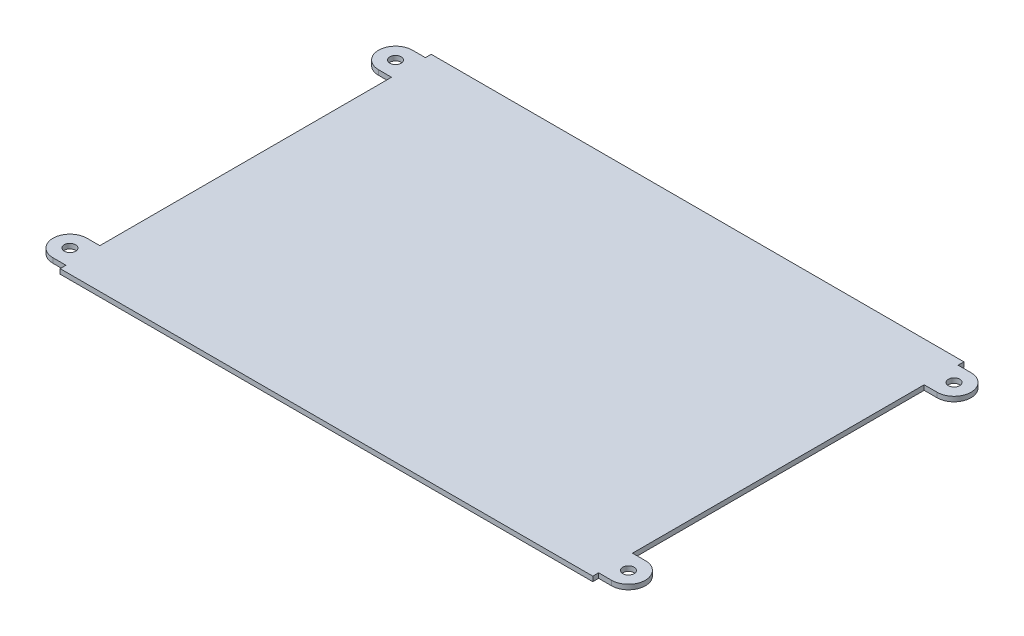
ISO-10303-21;
HEADER;
FILE_DESCRIPTION(('STEP AP214'),'2;1');
FILE_NAME('part.step','',(''),(''),'','','');
FILE_SCHEMA(('AUTOMOTIVE_DESIGN { 1 0 10303 214 1 1 1 1 }'));
ENDSEC;
DATA;
#1=APPLICATION_CONTEXT('core data for automotive mechanical design processes');
#2=APPLICATION_PROTOCOL_DEFINITION('international standard','automotive_design',2000,#1);
#3=PRODUCT_CONTEXT('',#1,'mechanical');
#4=PRODUCT('Part','Part','',(#3));
#5=PRODUCT_RELATED_PRODUCT_CATEGORY('part','',(#4));
#6=PRODUCT_DEFINITION_FORMATION('','',#4);
#7=PRODUCT_DEFINITION_CONTEXT('part definition',#1,'design');
#8=PRODUCT_DEFINITION('design','',#6,#7);
#9=PRODUCT_DEFINITION_SHAPE('','',#8);
#10=(LENGTH_UNIT() NAMED_UNIT(*) SI_UNIT(.MILLI.,.METRE.));
#11=(NAMED_UNIT(*) PLANE_ANGLE_UNIT() SI_UNIT($,.RADIAN.));
#12=(NAMED_UNIT(*) SI_UNIT($,.STERADIAN.) SOLID_ANGLE_UNIT());
#13=UNCERTAINTY_MEASURE_WITH_UNIT(LENGTH_MEASURE(1.E-05),#10,'distance_accuracy_value','');
#14=(GEOMETRIC_REPRESENTATION_CONTEXT(3) GLOBAL_UNCERTAINTY_ASSIGNED_CONTEXT((#13)) GLOBAL_UNIT_ASSIGNED_CONTEXT((#10,
#11,#12)) REPRESENTATION_CONTEXT('',''));
#15=CARTESIAN_POINT('',(0.,0.,0.));
#16=DIRECTION('',(0.,0.,1.));
#17=DIRECTION('',(1.,0.,0.));
#18=AXIS2_PLACEMENT_3D('',#15,#16,#17);
#19=CARTESIAN_POINT('',(82.45,1.5,57.45));
#20=DIRECTION('',(-1.,0.,0.));
#21=DIRECTION('',(0.,0.,1.));
#22=AXIS2_PLACEMENT_3D('',#19,#20,#21);
#23=PLANE('',#22);
#24=DIRECTION('',(0.,1.,0.));
#25=VECTOR('',#24,1.);
#26=CARTESIAN_POINT('',(82.45,-13.9933019691565,45.15));
#27=LINE('',#26,#25);
#28=CARTESIAN_POINT('',(82.45,0.,45.15));
#29=VERTEX_POINT('',#28);
#30=CARTESIAN_POINT('',(82.45,1.5,45.15));
#31=VERTEX_POINT('',#30);
#32=EDGE_CURVE('E184',#29,#31,#27,.T.);
#33=ORIENTED_EDGE('',*,*,#32,.F.);
#34=DIRECTION('',(0.,0.,-1.));
#35=VECTOR('',#34,1.);
#36=CARTESIAN_POINT('',(82.45,0.,57.45));
#37=LINE('',#36,#35);
#38=CARTESIAN_POINT('',(82.45,0.,-45.15));
#39=VERTEX_POINT('',#38);
#40=EDGE_CURVE('E201',#29,#39,#37,.T.);
#41=ORIENTED_EDGE('',*,*,#40,.T.);
#42=DIRECTION('',(0.,1.,0.));
#43=VECTOR('',#42,1.);
#44=CARTESIAN_POINT('',(82.45,-13.9933019691565,-45.15));
#45=LINE('',#44,#43);
#46=CARTESIAN_POINT('',(82.45,1.5,-45.15));
#47=VERTEX_POINT('',#46);
#48=EDGE_CURVE('E233',#39,#47,#45,.T.);
#49=ORIENTED_EDGE('',*,*,#48,.T.);
#50=DIRECTION('',(0.,0.,-1.));
#51=VECTOR('',#50,1.);
#52=CARTESIAN_POINT('',(82.45,1.5,57.45));
#53=LINE('',#52,#51);
#54=EDGE_CURVE('E37',#31,#47,#53,.T.);
#55=ORIENTED_EDGE('',*,*,#54,.F.);
#56=EDGE_LOOP('',(#33,#41,#49,#55));
#57=FACE_BOUND('',#56,.T.);
#58=ADVANCED_FACE('F33',(#57),#23,.F.);
#59=DIRECTION('',(0.,1.,0.));
#60=VECTOR('',#59,1.);
#61=CARTESIAN_POINT('',(82.45,-13.9933019691565,55.65));
#62=LINE('',#61,#60);
#63=CARTESIAN_POINT('',(82.45,0.,55.65));
#64=VERTEX_POINT('',#63);
#65=CARTESIAN_POINT('',(82.45,1.5,55.65));
#66=VERTEX_POINT('',#65);
#67=EDGE_CURVE('E58',#64,#66,#62,.T.);
#68=ORIENTED_EDGE('',*,*,#67,.T.);
#69=CARTESIAN_POINT('',(82.45,1.5,57.45));
#70=VERTEX_POINT('',#69);
#71=EDGE_CURVE('E298',#70,#66,#53,.T.);
#72=ORIENTED_EDGE('',*,*,#71,.F.);
#73=DIRECTION('',(0.,-1.,0.));
#74=VECTOR('',#73,1.);
#75=CARTESIAN_POINT('',(82.45,1.5,57.45));
#76=LINE('',#75,#74);
#77=CARTESIAN_POINT('',(82.45,0.,57.45));
#78=VERTEX_POINT('',#77);
#79=EDGE_CURVE('E43',#70,#78,#76,.T.);
#80=ORIENTED_EDGE('',*,*,#79,.T.);
#81=EDGE_CURVE('E254',#78,#64,#37,.T.);
#82=ORIENTED_EDGE('',*,*,#81,.T.);
#83=EDGE_LOOP('',(#68,#72,#80,#82));
#84=FACE_BOUND('',#83,.T.);
#85=ADVANCED_FACE('F323',(#84),#23,.F.);
#86=DIRECTION('',(0.,1.,0.));
#87=VECTOR('',#86,1.);
#88=CARTESIAN_POINT('',(82.45,-13.9933019691565,-55.65));
#89=LINE('',#88,#87);
#90=CARTESIAN_POINT('',(82.45,0.,-55.65));
#91=VERTEX_POINT('',#90);
#92=CARTESIAN_POINT('',(82.45,1.5,-55.65));
#93=VERTEX_POINT('',#92);
#94=EDGE_CURVE('E241',#91,#93,#89,.T.);
#95=ORIENTED_EDGE('',*,*,#94,.F.);
#96=CARTESIAN_POINT('',(82.45,0.,-57.45));
#97=VERTEX_POINT('',#96);
#98=EDGE_CURVE('E255',#91,#97,#37,.T.);
#99=ORIENTED_EDGE('',*,*,#98,.T.);
#100=DIRECTION('',(0.,-1.,0.));
#101=VECTOR('',#100,1.);
#102=CARTESIAN_POINT('',(82.45,1.5,-57.45));
#103=LINE('',#102,#101);
#104=CARTESIAN_POINT('',(82.45,1.5,-57.45));
#105=VERTEX_POINT('',#104);
#106=EDGE_CURVE('E321',#105,#97,#103,.T.);
#107=ORIENTED_EDGE('',*,*,#106,.F.);
#108=EDGE_CURVE('E303',#93,#105,#53,.T.);
#109=ORIENTED_EDGE('',*,*,#108,.F.);
#110=EDGE_LOOP('',(#95,#99,#107,#109));
#111=FACE_BOUND('',#110,.T.);
#112=ADVANCED_FACE('F325',(#111),#23,.F.);
#113=CARTESIAN_POINT('',(-82.45,1.5,57.45));
#114=DIRECTION('',(1.,0.,0.));
#115=DIRECTION('',(0.,0.,-1.));
#116=AXIS2_PLACEMENT_3D('',#113,#114,#115);
#117=PLANE('',#116);
#118=DIRECTION('',(0.,0.,1.));
#119=VECTOR('',#118,1.);
#120=CARTESIAN_POINT('',(-82.45,0.,57.45));
#121=LINE('',#120,#119);
#122=CARTESIAN_POINT('',(-82.45,0.,-45.15));
#123=VERTEX_POINT('',#122);
#124=CARTESIAN_POINT('',(-82.45,0.,45.15));
#125=VERTEX_POINT('',#124);
#126=EDGE_CURVE('E289',#123,#125,#121,.T.);
#127=ORIENTED_EDGE('',*,*,#126,.T.);
#128=DIRECTION('',(0.,1.,0.));
#129=VECTOR('',#128,1.);
#130=CARTESIAN_POINT('',(-82.45,-13.9933019691565,45.15));
#131=LINE('',#130,#129);
#132=CARTESIAN_POINT('',(-82.45,1.5,45.15));
#133=VERTEX_POINT('',#132);
#134=EDGE_CURVE('E358',#125,#133,#131,.T.);
#135=ORIENTED_EDGE('',*,*,#134,.T.);
#136=DIRECTION('',(0.,0.,1.));
#137=VECTOR('',#136,1.);
#138=CARTESIAN_POINT('',(-82.45,1.5,57.45));
#139=LINE('',#138,#137);
#140=CARTESIAN_POINT('',(-82.45,1.5,-45.15));
#141=VERTEX_POINT('',#140);
#142=EDGE_CURVE('E272',#141,#133,#139,.T.);
#143=ORIENTED_EDGE('',*,*,#142,.F.);
#144=DIRECTION('',(0.,1.,0.));
#145=VECTOR('',#144,1.);
#146=CARTESIAN_POINT('',(-82.45,-13.9933019691565,-45.15));
#147=LINE('',#146,#145);
#148=EDGE_CURVE('E360',#123,#141,#147,.T.);
#149=ORIENTED_EDGE('',*,*,#148,.F.);
#150=EDGE_LOOP('',(#127,#135,#143,#149));
#151=FACE_BOUND('',#150,.T.);
#152=ADVANCED_FACE('F331',(#151),#117,.F.);
#153=CARTESIAN_POINT('',(-82.45,1.5,55.65));
#154=VERTEX_POINT('',#153);
#155=CARTESIAN_POINT('',(-82.45,1.5,57.45));
#156=VERTEX_POINT('',#155);
#157=EDGE_CURVE('E269',#154,#156,#139,.T.);
#158=ORIENTED_EDGE('',*,*,#157,.F.);
#159=DIRECTION('',(0.,1.,0.));
#160=VECTOR('',#159,1.);
#161=CARTESIAN_POINT('',(-82.45,-13.9933019691565,55.65));
#162=LINE('',#161,#160);
#163=CARTESIAN_POINT('',(-82.45,0.,55.65));
#164=VERTEX_POINT('',#163);
#165=EDGE_CURVE('E376',#164,#154,#162,.T.);
#166=ORIENTED_EDGE('',*,*,#165,.F.);
#167=CARTESIAN_POINT('',(-82.45,0.,57.45));
#168=VERTEX_POINT('',#167);
#169=EDGE_CURVE('E273',#164,#168,#121,.T.);
#170=ORIENTED_EDGE('',*,*,#169,.T.);
#171=DIRECTION('',(0.,-1.,0.));
#172=VECTOR('',#171,1.);
#173=CARTESIAN_POINT('',(-82.45,1.5,57.45));
#174=LINE('',#173,#172);
#175=EDGE_CURVE('E11',#156,#168,#174,.T.);
#176=ORIENTED_EDGE('',*,*,#175,.F.);
#177=EDGE_LOOP('',(#158,#166,#170,#176));
#178=FACE_BOUND('',#177,.T.);
#179=ADVANCED_FACE('F342',(#178),#117,.F.);
#180=CARTESIAN_POINT('',(-82.45,0.,-57.45));
#181=VERTEX_POINT('',#180);
#182=CARTESIAN_POINT('',(-82.45,0.,-55.65));
#183=VERTEX_POINT('',#182);
#184=EDGE_CURVE('E291',#181,#183,#121,.T.);
#185=ORIENTED_EDGE('',*,*,#184,.T.);
#186=DIRECTION('',(0.,1.,0.));
#187=VECTOR('',#186,1.);
#188=CARTESIAN_POINT('',(-82.45,-13.9933019691565,-55.65));
#189=LINE('',#188,#187);
#190=CARTESIAN_POINT('',(-82.45,1.5,-55.6499999999999));
#191=VERTEX_POINT('',#190);
#192=EDGE_CURVE('E401',#183,#191,#189,.T.);
#193=ORIENTED_EDGE('',*,*,#192,.T.);
#194=CARTESIAN_POINT('',(-82.45,1.5,-57.45));
#195=VERTEX_POINT('',#194);
#196=EDGE_CURVE('E286',#195,#191,#139,.T.);
#197=ORIENTED_EDGE('',*,*,#196,.F.);
#198=DIRECTION('',(0.,-1.,0.));
#199=VECTOR('',#198,1.);
#200=CARTESIAN_POINT('',(-82.45,1.5,-57.45));
#201=LINE('',#200,#199);
#202=EDGE_CURVE('E297',#195,#181,#201,.T.);
#203=ORIENTED_EDGE('',*,*,#202,.T.);
#204=EDGE_LOOP('',(#185,#193,#197,#203));
#205=FACE_BOUND('',#204,.T.);
#206=ADVANCED_FACE('F35',(#205),#117,.F.);
#207=CARTESIAN_POINT('',(-82.45,1.5,57.45));
#208=DIRECTION('',(0.,0.,-1.));
#209=DIRECTION('',(-1.,0.,0.));
#210=AXIS2_PLACEMENT_3D('',#207,#208,#209);
#211=PLANE('',#210);
#212=DIRECTION('',(1.,0.,0.));
#213=VECTOR('',#212,1.);
#214=CARTESIAN_POINT('',(-82.45,0.,57.45));
#215=LINE('',#214,#213);
#216=EDGE_CURVE('E259',#168,#78,#215,.T.);
#217=ORIENTED_EDGE('',*,*,#216,.T.);
#218=ORIENTED_EDGE('',*,*,#79,.F.);
#219=DIRECTION('',(1.,0.,0.));
#220=VECTOR('',#219,1.);
#221=CARTESIAN_POINT('',(-82.45,1.5,57.45));
#222=LINE('',#221,#220);
#223=EDGE_CURVE('E280',#156,#70,#222,.T.);
#224=ORIENTED_EDGE('',*,*,#223,.F.);
#225=ORIENTED_EDGE('',*,*,#175,.T.);
#226=EDGE_LOOP('',(#217,#218,#224,#225));
#227=FACE_BOUND('',#226,.T.);
#228=ADVANCED_FACE('F318',(#227),#211,.F.);
#229=CARTESIAN_POINT('',(-82.45,1.5,-57.45));
#230=DIRECTION('',(0.,0.,1.));
#231=DIRECTION('',(1.,0.,0.));
#232=AXIS2_PLACEMENT_3D('',#229,#230,#231);
#233=PLANE('',#232);
#234=DIRECTION('',(-1.,0.,0.));
#235=VECTOR('',#234,1.);
#236=CARTESIAN_POINT('',(-82.45,0.,-57.45));
#237=LINE('',#236,#235);
#238=EDGE_CURVE('E261',#97,#181,#237,.T.);
#239=ORIENTED_EDGE('',*,*,#238,.T.);
#240=ORIENTED_EDGE('',*,*,#202,.F.);
#241=DIRECTION('',(-1.,0.,0.));
#242=VECTOR('',#241,1.);
#243=CARTESIAN_POINT('',(-82.45,1.5,-57.45));
#244=LINE('',#243,#242);
#245=EDGE_CURVE('E294',#105,#195,#244,.T.);
#246=ORIENTED_EDGE('',*,*,#245,.F.);
#247=ORIENTED_EDGE('',*,*,#106,.T.);
#248=EDGE_LOOP('',(#239,#240,#246,#247));
#249=FACE_BOUND('',#248,.T.);
#250=ADVANCED_FACE('F334',(#249),#233,.F.);
#251=CARTESIAN_POINT('',(0.,1.5,0.));
#252=DIRECTION('',(0.,-1.,0.));
#253=DIRECTION('',(0.,0.,-1.));
#254=AXIS2_PLACEMENT_3D('',#251,#252,#253);
#255=PLANE('',#254);
#256=ORIENTED_EDGE('',*,*,#196,.T.);
#257=DIRECTION('',(-1.,0.,0.));
#258=VECTOR('',#257,1.);
#259=CARTESIAN_POINT('',(-86.45,1.5,-55.65));
#260=LINE('',#259,#258);
#261=CARTESIAN_POINT('',(-86.45,1.5,-55.65));
#262=VERTEX_POINT('',#261);
#263=EDGE_CURVE('E394',#191,#262,#260,.T.);
#264=ORIENTED_EDGE('',*,*,#263,.T.);
#265=CARTESIAN_POINT('',(-86.45,1.5,-50.4));
#266=DIRECTION('',(0.,1.,0.));
#267=DIRECTION('',(0.,0.,1.));
#268=AXIS2_PLACEMENT_3D('',#265,#266,#267);
#269=CIRCLE('',#268,5.24999999999999);
#270=CARTESIAN_POINT('',(-86.45,1.5,-45.15));
#271=VERTEX_POINT('',#270);
#272=EDGE_CURVE('E384',#262,#271,#269,.T.);
#273=ORIENTED_EDGE('',*,*,#272,.T.);
#274=DIRECTION('',(1.,0.,0.));
#275=VECTOR('',#274,1.);
#276=CARTESIAN_POINT('',(-86.45,1.5,-45.15));
#277=LINE('',#276,#275);
#278=EDGE_CURVE('E387',#271,#141,#277,.T.);
#279=ORIENTED_EDGE('',*,*,#278,.T.);
#280=ORIENTED_EDGE('',*,*,#142,.T.);
#281=DIRECTION('',(-1.,0.,0.));
#282=VECTOR('',#281,1.);
#283=CARTESIAN_POINT('',(-86.45,1.5,45.15));
#284=LINE('',#283,#282);
#285=CARTESIAN_POINT('',(-86.45,1.5,45.15));
#286=VERTEX_POINT('',#285);
#287=EDGE_CURVE('E372',#133,#286,#284,.T.);
#288=ORIENTED_EDGE('',*,*,#287,.T.);
#289=CARTESIAN_POINT('',(-86.45,1.5,50.4));
#290=DIRECTION('',(0.,1.,0.));
#291=DIRECTION('',(0.,0.,1.));
#292=AXIS2_PLACEMENT_3D('',#289,#290,#291);
#293=CIRCLE('',#292,5.24999999999999);
#294=CARTESIAN_POINT('',(-86.45,1.5,55.65));
#295=VERTEX_POINT('',#294);
#296=EDGE_CURVE('E453',#286,#295,#293,.T.);
#297=ORIENTED_EDGE('',*,*,#296,.T.);
#298=DIRECTION('',(1.,0.,0.));
#299=VECTOR('',#298,1.);
#300=CARTESIAN_POINT('',(-86.45,1.5,55.65));
#301=LINE('',#300,#299);
#302=EDGE_CURVE('E451',#295,#154,#301,.T.);
#303=ORIENTED_EDGE('',*,*,#302,.T.);
#304=ORIENTED_EDGE('',*,*,#157,.T.);
#305=ORIENTED_EDGE('',*,*,#223,.T.);
#306=ORIENTED_EDGE('',*,*,#71,.T.);
#307=DIRECTION('',(-1.,0.,0.));
#308=VECTOR('',#307,1.);
#309=CARTESIAN_POINT('',(86.45,1.5,55.65));
#310=LINE('',#309,#308);
#311=CARTESIAN_POINT('',(86.45,1.5,55.65));
#312=VERTEX_POINT('',#311);
#313=EDGE_CURVE('E185',#312,#66,#310,.T.);
#314=ORIENTED_EDGE('',*,*,#313,.F.);
#315=CARTESIAN_POINT('',(86.45,1.5,50.4));
#316=DIRECTION('',(0.,-1.,0.));
#317=DIRECTION('',(0.,0.,1.));
#318=AXIS2_PLACEMENT_3D('',#315,#316,#317);
#319=CIRCLE('',#318,5.24999999999999);
#320=CARTESIAN_POINT('',(86.45,1.5,45.15));
#321=VERTEX_POINT('',#320);
#322=EDGE_CURVE('E210',#321,#312,#319,.T.);
#323=ORIENTED_EDGE('',*,*,#322,.F.);
#324=DIRECTION('',(1.,0.,0.));
#325=VECTOR('',#324,1.);
#326=CARTESIAN_POINT('',(86.45,1.5,45.15));
#327=LINE('',#326,#325);
#328=EDGE_CURVE('E180',#31,#321,#327,.T.);
#329=ORIENTED_EDGE('',*,*,#328,.F.);
#330=ORIENTED_EDGE('',*,*,#54,.T.);
#331=DIRECTION('',(-1.,0.,0.));
#332=VECTOR('',#331,1.);
#333=CARTESIAN_POINT('',(86.45,1.5,-45.15));
#334=LINE('',#333,#332);
#335=CARTESIAN_POINT('',(86.45,1.5,-45.15));
#336=VERTEX_POINT('',#335);
#337=EDGE_CURVE('E248',#336,#47,#334,.T.);
#338=ORIENTED_EDGE('',*,*,#337,.F.);
#339=CARTESIAN_POINT('',(86.45,1.5,-50.4));
#340=DIRECTION('',(0.,-1.,0.));
#341=DIRECTION('',(0.,0.,1.));
#342=AXIS2_PLACEMENT_3D('',#339,#340,#341);
#343=CIRCLE('',#342,5.24999999999999);
#344=CARTESIAN_POINT('',(86.45,1.5,-55.65));
#345=VERTEX_POINT('',#344);
#346=EDGE_CURVE('E226',#345,#336,#343,.T.);
#347=ORIENTED_EDGE('',*,*,#346,.F.);
#348=DIRECTION('',(1.,0.,0.));
#349=VECTOR('',#348,1.);
#350=CARTESIAN_POINT('',(86.45,1.5,-55.65));
#351=LINE('',#350,#349);
#352=EDGE_CURVE('E229',#93,#345,#351,.T.);
#353=ORIENTED_EDGE('',*,*,#352,.F.);
#354=ORIENTED_EDGE('',*,*,#108,.T.);
#355=ORIENTED_EDGE('',*,*,#245,.T.);
#356=EDGE_LOOP('',(#256,#264,#273,#279,#280,#288,#297,#303,#304,#305,#306,#314,#323,#329,#330,
#338,#347,#353,#354,#355));
#357=FACE_BOUND('',#356,.T.);
#358=CARTESIAN_POINT('',(-86.45,1.5,-50.4));
#359=DIRECTION('',(0.,1.,0.));
#360=DIRECTION('',(0.,0.,1.));
#361=AXIS2_PLACEMENT_3D('',#358,#359,#360);
#362=CIRCLE('',#361,1.75);
#363=CARTESIAN_POINT('',(-86.45,1.5,-48.65));
#364=VERTEX_POINT('',#363);
#365=EDGE_CURVE('E388',#364,#364,#362,.T.);
#366=ORIENTED_EDGE('',*,*,#365,.F.);
#367=EDGE_LOOP('',(#366));
#368=FACE_BOUND('',#367,.T.);
#369=CARTESIAN_POINT('',(-86.45,1.5,50.4));
#370=DIRECTION('',(0.,1.,0.));
#371=DIRECTION('',(0.,0.,1.));
#372=AXIS2_PLACEMENT_3D('',#369,#370,#371);
#373=CIRCLE('',#372,1.75);
#374=CARTESIAN_POINT('',(-86.45,1.5,52.15));
#375=VERTEX_POINT('',#374);
#376=EDGE_CURVE('E382',#375,#375,#373,.T.);
#377=ORIENTED_EDGE('',*,*,#376,.F.);
#378=EDGE_LOOP('',(#377));
#379=FACE_BOUND('',#378,.T.);
#380=CARTESIAN_POINT('',(86.45,1.5,-50.4));
#381=DIRECTION('',(0.,-1.,0.));
#382=DIRECTION('',(0.,0.,1.));
#383=AXIS2_PLACEMENT_3D('',#380,#381,#382);
#384=CIRCLE('',#383,1.75);
#385=CARTESIAN_POINT('',(86.45,1.5,-48.65));
#386=VERTEX_POINT('',#385);
#387=EDGE_CURVE('E222',#386,#386,#384,.T.);
#388=ORIENTED_EDGE('',*,*,#387,.T.);
#389=EDGE_LOOP('',(#388));
#390=FACE_BOUND('',#389,.T.);
#391=CARTESIAN_POINT('',(86.45,1.5,50.4));
#392=DIRECTION('',(0.,-1.,0.));
#393=DIRECTION('',(0.,0.,1.));
#394=AXIS2_PLACEMENT_3D('',#391,#392,#393);
#395=CIRCLE('',#394,1.75);
#396=CARTESIAN_POINT('',(86.45,1.5,52.15));
#397=VERTEX_POINT('',#396);
#398=EDGE_CURVE('E194',#397,#397,#395,.T.);
#399=ORIENTED_EDGE('',*,*,#398,.T.);
#400=EDGE_LOOP('',(#399));
#401=FACE_BOUND('',#400,.T.);
#402=ADVANCED_FACE('F312',(#357,#368,#379,#390,#401),#255,.F.);
#403=CARTESIAN_POINT('',(0.,0.,0.));
#404=DIRECTION('',(0.,-1.,0.));
#405=DIRECTION('',(0.,0.,-1.));
#406=AXIS2_PLACEMENT_3D('',#403,#404,#405);
#407=PLANE('',#406);
#408=ORIENTED_EDGE('',*,*,#184,.F.);
#409=ORIENTED_EDGE('',*,*,#238,.F.);
#410=ORIENTED_EDGE('',*,*,#98,.F.);
#411=DIRECTION('',(1.,0.,0.));
#412=VECTOR('',#411,1.);
#413=CARTESIAN_POINT('',(86.45,0.,-55.65));
#414=LINE('',#413,#412);
#415=CARTESIAN_POINT('',(86.45,0.,-55.65));
#416=VERTEX_POINT('',#415);
#417=EDGE_CURVE('E245',#91,#416,#414,.T.);
#418=ORIENTED_EDGE('',*,*,#417,.T.);
#419=CARTESIAN_POINT('',(86.45,0.,-50.4));
#420=DIRECTION('',(0.,-1.,0.));
#421=DIRECTION('',(0.,0.,-1.));
#422=AXIS2_PLACEMENT_3D('',#419,#420,#421);
#423=CIRCLE('',#422,5.24999999999999);
#424=CARTESIAN_POINT('',(86.45,0.,-45.15));
#425=VERTEX_POINT('',#424);
#426=EDGE_CURVE('E219',#416,#425,#423,.T.);
#427=ORIENTED_EDGE('',*,*,#426,.T.);
#428=DIRECTION('',(-1.,0.,0.));
#429=VECTOR('',#428,1.);
#430=CARTESIAN_POINT('',(86.45,0.,-45.15));
#431=LINE('',#430,#429);
#432=EDGE_CURVE('E223',#425,#39,#431,.T.);
#433=ORIENTED_EDGE('',*,*,#432,.T.);
#434=ORIENTED_EDGE('',*,*,#40,.F.);
#435=DIRECTION('',(1.,0.,0.));
#436=VECTOR('',#435,1.);
#437=CARTESIAN_POINT('',(86.45,0.,45.15));
#438=LINE('',#437,#436);
#439=CARTESIAN_POINT('',(86.45,0.,45.15));
#440=VERTEX_POINT('',#439);
#441=EDGE_CURVE('E178',#29,#440,#438,.T.);
#442=ORIENTED_EDGE('',*,*,#441,.T.);
#443=CARTESIAN_POINT('',(86.45,0.,50.4));
#444=DIRECTION('',(0.,-1.,0.));
#445=DIRECTION('',(0.,0.,-1.));
#446=AXIS2_PLACEMENT_3D('',#443,#444,#445);
#447=CIRCLE('',#446,5.24999999999999);
#448=CARTESIAN_POINT('',(86.45,0.,55.65));
#449=VERTEX_POINT('',#448);
#450=EDGE_CURVE('E189',#440,#449,#447,.T.);
#451=ORIENTED_EDGE('',*,*,#450,.T.);
#452=DIRECTION('',(-1.,0.,0.));
#453=VECTOR('',#452,1.);
#454=CARTESIAN_POINT('',(86.45,0.,55.65));
#455=LINE('',#454,#453);
#456=EDGE_CURVE('E195',#449,#64,#455,.T.);
#457=ORIENTED_EDGE('',*,*,#456,.T.);
#458=ORIENTED_EDGE('',*,*,#81,.F.);
#459=ORIENTED_EDGE('',*,*,#216,.F.);
#460=ORIENTED_EDGE('',*,*,#169,.F.);
#461=DIRECTION('',(1.,0.,0.));
#462=VECTOR('',#461,1.);
#463=CARTESIAN_POINT('',(-86.45,0.,55.65));
#464=LINE('',#463,#462);
#465=CARTESIAN_POINT('',(-86.45,0.,55.65));
#466=VERTEX_POINT('',#465);
#467=EDGE_CURVE('E373',#466,#164,#464,.T.);
#468=ORIENTED_EDGE('',*,*,#467,.F.);
#469=CARTESIAN_POINT('',(-86.45,0.,50.4));
#470=DIRECTION('',(0.,-1.,0.));
#471=DIRECTION('',(0.,0.,-1.));
#472=AXIS2_PLACEMENT_3D('',#469,#470,#471);
#473=CIRCLE('',#472,5.24999999999999);
#474=CARTESIAN_POINT('',(-86.45,0.,45.15));
#475=VERTEX_POINT('',#474);
#476=EDGE_CURVE('E232',#475,#466,#473,.F.);
#477=ORIENTED_EDGE('',*,*,#476,.F.);
#478=DIRECTION('',(-1.,0.,0.));
#479=VECTOR('',#478,1.);
#480=CARTESIAN_POINT('',(-86.45,0.,45.15));
#481=LINE('',#480,#479);
#482=EDGE_CURVE('E362',#125,#475,#481,.T.);
#483=ORIENTED_EDGE('',*,*,#482,.F.);
#484=ORIENTED_EDGE('',*,*,#126,.F.);
#485=DIRECTION('',(1.,0.,0.));
#486=VECTOR('',#485,1.);
#487=CARTESIAN_POINT('',(-86.45,0.,-45.15));
#488=LINE('',#487,#486);
#489=CARTESIAN_POINT('',(-86.45,0.,-45.15));
#490=VERTEX_POINT('',#489);
#491=EDGE_CURVE('E409',#490,#123,#488,.T.);
#492=ORIENTED_EDGE('',*,*,#491,.F.);
#493=CARTESIAN_POINT('',(-86.45,0.,-50.4));
#494=DIRECTION('',(0.,-1.,0.));
#495=DIRECTION('',(0.,0.,-1.));
#496=AXIS2_PLACEMENT_3D('',#493,#494,#495);
#497=CIRCLE('',#496,5.24999999999999);
#498=CARTESIAN_POINT('',(-86.45,0.,-55.65));
#499=VERTEX_POINT('',#498);
#500=EDGE_CURVE('E395',#499,#490,#497,.F.);
#501=ORIENTED_EDGE('',*,*,#500,.F.);
#502=DIRECTION('',(-1.,0.,0.));
#503=VECTOR('',#502,1.);
#504=CARTESIAN_POINT('',(-86.45,0.,-55.65));
#505=LINE('',#504,#503);
#506=EDGE_CURVE('E402',#183,#499,#505,.T.);
#507=ORIENTED_EDGE('',*,*,#506,.F.);
#508=EDGE_LOOP('',(#408,#409,#410,#418,#427,#433,#434,#442,#451,#457,#458,#459,#460,#468,#477,
#483,#484,#492,#501,#507));
#509=FACE_BOUND('',#508,.T.);
#510=CARTESIAN_POINT('',(-86.45,0.,-50.4));
#511=DIRECTION('',(0.,-1.,0.));
#512=DIRECTION('',(0.,0.,-1.));
#513=AXIS2_PLACEMENT_3D('',#510,#511,#512);
#514=CIRCLE('',#513,1.75);
#515=CARTESIAN_POINT('',(-86.45,0.,-52.15));
#516=VERTEX_POINT('',#515);
#517=EDGE_CURVE('E391',#516,#516,#514,.F.);
#518=ORIENTED_EDGE('',*,*,#517,.T.);
#519=EDGE_LOOP('',(#518));
#520=FACE_BOUND('',#519,.T.);
#521=CARTESIAN_POINT('',(-86.45,0.,50.4));
#522=DIRECTION('',(0.,-1.,0.));
#523=DIRECTION('',(0.,0.,-1.));
#524=AXIS2_PLACEMENT_3D('',#521,#522,#523);
#525=CIRCLE('',#524,1.75);
#526=CARTESIAN_POINT('',(-86.45,0.,48.65));
#527=VERTEX_POINT('',#526);
#528=EDGE_CURVE('E398',#527,#527,#525,.F.);
#529=ORIENTED_EDGE('',*,*,#528,.T.);
#530=EDGE_LOOP('',(#529));
#531=FACE_BOUND('',#530,.T.);
#532=CARTESIAN_POINT('',(86.45,0.,-50.4));
#533=DIRECTION('',(0.,-1.,0.));
#534=DIRECTION('',(0.,0.,-1.));
#535=AXIS2_PLACEMENT_3D('',#532,#533,#534);
#536=CIRCLE('',#535,1.75);
#537=CARTESIAN_POINT('',(86.45,0.,-52.15));
#538=VERTEX_POINT('',#537);
#539=EDGE_CURVE('E216',#538,#538,#536,.T.);
#540=ORIENTED_EDGE('',*,*,#539,.F.);
#541=EDGE_LOOP('',(#540));
#542=FACE_BOUND('',#541,.T.);
#543=CARTESIAN_POINT('',(86.45,0.,50.4));
#544=DIRECTION('',(0.,-1.,0.));
#545=DIRECTION('',(0.,0.,-1.));
#546=AXIS2_PLACEMENT_3D('',#543,#544,#545);
#547=CIRCLE('',#546,1.75);
#548=CARTESIAN_POINT('',(86.45,0.,48.65));
#549=VERTEX_POINT('',#548);
#550=EDGE_CURVE('E202',#549,#549,#547,.T.);
#551=ORIENTED_EDGE('',*,*,#550,.F.);
#552=EDGE_LOOP('',(#551));
#553=FACE_BOUND('',#552,.T.);
#554=ADVANCED_FACE('F198',(#509,#520,#531,#542,#553),#407,.T.);
#555=CARTESIAN_POINT('',(-86.45,-13.9933019691565,-50.4));
#556=DIRECTION('',(0.,1.,0.));
#557=DIRECTION('',(0.,0.,1.));
#558=AXIS2_PLACEMENT_3D('',#555,#556,#557);
#559=CYLINDRICAL_SURFACE('',#558,5.24999999999999);
#560=DIRECTION('',(0.,1.,0.));
#561=VECTOR('',#560,1.);
#562=CARTESIAN_POINT('',(-86.45,-13.9933019691565,-55.65));
#563=LINE('',#562,#561);
#564=EDGE_CURVE('E399',#499,#262,#563,.T.);
#565=ORIENTED_EDGE('',*,*,#564,.F.);
#566=ORIENTED_EDGE('',*,*,#500,.T.);
#567=DIRECTION('',(0.,1.,0.));
#568=VECTOR('',#567,1.);
#569=CARTESIAN_POINT('',(-86.45,-13.9933019691565,-45.15));
#570=LINE('',#569,#568);
#571=EDGE_CURVE('E278',#490,#271,#570,.T.);
#572=ORIENTED_EDGE('',*,*,#571,.T.);
#573=ORIENTED_EDGE('',*,*,#272,.F.);
#574=EDGE_LOOP('',(#565,#566,#572,#573));
#575=FACE_BOUND('',#574,.T.);
#576=ADVANCED_FACE('F511',(#575),#559,.T.);
#577=CARTESIAN_POINT('',(-86.45,-13.9933019691565,-55.65));
#578=DIRECTION('',(0.,0.,-1.));
#579=DIRECTION('',(-1.,0.,0.));
#580=AXIS2_PLACEMENT_3D('',#577,#578,#579);
#581=PLANE('',#580);
#582=ORIENTED_EDGE('',*,*,#192,.F.);
#583=ORIENTED_EDGE('',*,*,#506,.T.);
#584=ORIENTED_EDGE('',*,*,#564,.T.);
#585=ORIENTED_EDGE('',*,*,#263,.F.);
#586=EDGE_LOOP('',(#582,#583,#584,#585));
#587=FACE_BOUND('',#586,.T.);
#588=ADVANCED_FACE('F427',(#587),#581,.T.);
#589=CARTESIAN_POINT('',(-86.45,-13.9933019691565,-45.15));
#590=DIRECTION('',(0.,0.,1.));
#591=DIRECTION('',(1.,0.,0.));
#592=AXIS2_PLACEMENT_3D('',#589,#590,#591);
#593=PLANE('',#592);
#594=ORIENTED_EDGE('',*,*,#571,.F.);
#595=ORIENTED_EDGE('',*,*,#491,.T.);
#596=ORIENTED_EDGE('',*,*,#148,.T.);
#597=ORIENTED_EDGE('',*,*,#278,.F.);
#598=EDGE_LOOP('',(#594,#595,#596,#597));
#599=FACE_BOUND('',#598,.T.);
#600=ADVANCED_FACE('F505',(#599),#593,.T.);
#601=CARTESIAN_POINT('',(-86.45,-13.9933019691565,-50.4));
#602=DIRECTION('',(0.,1.,0.));
#603=DIRECTION('',(0.,0.,1.));
#604=AXIS2_PLACEMENT_3D('',#601,#602,#603);
#605=CYLINDRICAL_SURFACE('',#604,1.75);
#606=ORIENTED_EDGE('',*,*,#365,.T.);
#607=EDGE_LOOP('',(#606));
#608=FACE_BOUND('',#607,.T.);
#609=ORIENTED_EDGE('',*,*,#517,.F.);
#610=EDGE_LOOP('',(#609));
#611=FACE_BOUND('',#610,.T.);
#612=ADVANCED_FACE('F501',(#608,#611),#605,.F.);
#613=CARTESIAN_POINT('',(-86.45,-13.9933019691565,50.4));
#614=DIRECTION('',(0.,1.,0.));
#615=DIRECTION('',(0.,0.,1.));
#616=AXIS2_PLACEMENT_3D('',#613,#614,#615);
#617=CYLINDRICAL_SURFACE('',#616,5.24999999999999);
#618=DIRECTION('',(0.,1.,0.));
#619=VECTOR('',#618,1.);
#620=CARTESIAN_POINT('',(-86.45,-13.9933019691565,45.15));
#621=LINE('',#620,#619);
#622=EDGE_CURVE('E366',#475,#286,#621,.T.);
#623=ORIENTED_EDGE('',*,*,#622,.F.);
#624=ORIENTED_EDGE('',*,*,#476,.T.);
#625=DIRECTION('',(0.,1.,0.));
#626=VECTOR('',#625,1.);
#627=CARTESIAN_POINT('',(-86.45,-13.9933019691565,55.65));
#628=LINE('',#627,#626);
#629=EDGE_CURVE('E367',#466,#295,#628,.T.);
#630=ORIENTED_EDGE('',*,*,#629,.T.);
#631=ORIENTED_EDGE('',*,*,#296,.F.);
#632=EDGE_LOOP('',(#623,#624,#630,#631));
#633=FACE_BOUND('',#632,.T.);
#634=ADVANCED_FACE('F462',(#633),#617,.T.);
#635=CARTESIAN_POINT('',(-86.45,-13.9933019691565,45.15));
#636=DIRECTION('',(0.,0.,-1.));
#637=DIRECTION('',(-1.,0.,0.));
#638=AXIS2_PLACEMENT_3D('',#635,#636,#637);
#639=PLANE('',#638);
#640=ORIENTED_EDGE('',*,*,#134,.F.);
#641=ORIENTED_EDGE('',*,*,#482,.T.);
#642=ORIENTED_EDGE('',*,*,#622,.T.);
#643=ORIENTED_EDGE('',*,*,#287,.F.);
#644=EDGE_LOOP('',(#640,#641,#642,#643));
#645=FACE_BOUND('',#644,.T.);
#646=ADVANCED_FACE('F370',(#645),#639,.T.);
#647=CARTESIAN_POINT('',(-86.45,-13.9933019691565,55.65));
#648=DIRECTION('',(0.,0.,1.));
#649=DIRECTION('',(1.,0.,0.));
#650=AXIS2_PLACEMENT_3D('',#647,#648,#649);
#651=PLANE('',#650);
#652=ORIENTED_EDGE('',*,*,#629,.F.);
#653=ORIENTED_EDGE('',*,*,#467,.T.);
#654=ORIENTED_EDGE('',*,*,#165,.T.);
#655=ORIENTED_EDGE('',*,*,#302,.F.);
#656=EDGE_LOOP('',(#652,#653,#654,#655));
#657=FACE_BOUND('',#656,.T.);
#658=ADVANCED_FACE('F466',(#657),#651,.T.);
#659=CARTESIAN_POINT('',(-86.45,-13.9933019691565,50.4));
#660=DIRECTION('',(0.,1.,0.));
#661=DIRECTION('',(0.,0.,1.));
#662=AXIS2_PLACEMENT_3D('',#659,#660,#661);
#663=CYLINDRICAL_SURFACE('',#662,1.75);
#664=ORIENTED_EDGE('',*,*,#376,.T.);
#665=EDGE_LOOP('',(#664));
#666=FACE_BOUND('',#665,.T.);
#667=ORIENTED_EDGE('',*,*,#528,.F.);
#668=EDGE_LOOP('',(#667));
#669=FACE_BOUND('',#668,.T.);
#670=ADVANCED_FACE('F492',(#666,#669),#663,.F.);
#671=CARTESIAN_POINT('',(86.45,-13.9933019691565,-55.65));
#672=DIRECTION('',(0.,0.,1.));
#673=DIRECTION('',(1.,0.,0.));
#674=AXIS2_PLACEMENT_3D('',#671,#672,#673);
#675=PLANE('',#674);
#676=ORIENTED_EDGE('',*,*,#417,.F.);
#677=ORIENTED_EDGE('',*,*,#94,.T.);
#678=ORIENTED_EDGE('',*,*,#352,.T.);
#679=DIRECTION('',(0.,1.,0.));
#680=VECTOR('',#679,1.);
#681=CARTESIAN_POINT('',(86.45,-13.9933019691565,-55.65));
#682=LINE('',#681,#680);
#683=EDGE_CURVE('E251',#416,#345,#682,.T.);
#684=ORIENTED_EDGE('',*,*,#683,.F.);
#685=EDGE_LOOP('',(#676,#677,#678,#684));
#686=FACE_BOUND('',#685,.T.);
#687=ADVANCED_FACE('F440',(#686),#675,.F.);
#688=CARTESIAN_POINT('',(86.45,-13.9933019691565,-45.15));
#689=DIRECTION('',(0.,0.,-1.));
#690=DIRECTION('',(-1.,0.,0.));
#691=AXIS2_PLACEMENT_3D('',#688,#689,#690);
#692=PLANE('',#691);
#693=ORIENTED_EDGE('',*,*,#432,.F.);
#694=DIRECTION('',(0.,1.,0.));
#695=VECTOR('',#694,1.);
#696=CARTESIAN_POINT('',(86.45,-13.9933019691565,-45.15));
#697=LINE('',#696,#695);
#698=EDGE_CURVE('E230',#425,#336,#697,.T.);
#699=ORIENTED_EDGE('',*,*,#698,.T.);
#700=ORIENTED_EDGE('',*,*,#337,.T.);
#701=ORIENTED_EDGE('',*,*,#48,.F.);
#702=EDGE_LOOP('',(#693,#699,#700,#701));
#703=FACE_BOUND('',#702,.T.);
#704=ADVANCED_FACE('F486',(#703),#692,.F.);
#705=CARTESIAN_POINT('',(86.45,-13.9933019691565,-50.4));
#706=DIRECTION('',(0.,1.,0.));
#707=DIRECTION('',(0.,0.,1.));
#708=AXIS2_PLACEMENT_3D('',#705,#706,#707);
#709=CYLINDRICAL_SURFACE('',#708,5.24999999999999);
#710=ORIENTED_EDGE('',*,*,#426,.F.);
#711=ORIENTED_EDGE('',*,*,#683,.T.);
#712=ORIENTED_EDGE('',*,*,#346,.T.);
#713=ORIENTED_EDGE('',*,*,#698,.F.);
#714=EDGE_LOOP('',(#710,#711,#712,#713));
#715=FACE_BOUND('',#714,.T.);
#716=ADVANCED_FACE('F484',(#715),#709,.T.);
#717=CARTESIAN_POINT('',(86.45,-13.9933019691565,-50.4));
#718=DIRECTION('',(0.,1.,0.));
#719=DIRECTION('',(0.,0.,1.));
#720=AXIS2_PLACEMENT_3D('',#717,#718,#719);
#721=CYLINDRICAL_SURFACE('',#720,1.75);
#722=ORIENTED_EDGE('',*,*,#387,.F.);
#723=EDGE_LOOP('',(#722));
#724=FACE_BOUND('',#723,.T.);
#725=ORIENTED_EDGE('',*,*,#539,.T.);
#726=EDGE_LOOP('',(#725));
#727=FACE_BOUND('',#726,.T.);
#728=ADVANCED_FACE('F478',(#724,#727),#721,.F.);
#729=CARTESIAN_POINT('',(86.45,-13.9933019691565,45.15));
#730=DIRECTION('',(0.,0.,1.));
#731=DIRECTION('',(1.,0.,0.));
#732=AXIS2_PLACEMENT_3D('',#729,#730,#731);
#733=PLANE('',#732);
#734=ORIENTED_EDGE('',*,*,#441,.F.);
#735=ORIENTED_EDGE('',*,*,#32,.T.);
#736=ORIENTED_EDGE('',*,*,#328,.T.);
#737=DIRECTION('',(0.,1.,0.));
#738=VECTOR('',#737,1.);
#739=CARTESIAN_POINT('',(86.45,-13.9933019691565,45.15));
#740=LINE('',#739,#738);
#741=EDGE_CURVE('E174',#440,#321,#740,.T.);
#742=ORIENTED_EDGE('',*,*,#741,.F.);
#743=EDGE_LOOP('',(#734,#735,#736,#742));
#744=FACE_BOUND('',#743,.T.);
#745=ADVANCED_FACE('F176',(#744),#733,.F.);
#746=CARTESIAN_POINT('',(86.45,-13.9933019691565,55.65));
#747=DIRECTION('',(0.,0.,-1.));
#748=DIRECTION('',(-1.,0.,0.));
#749=AXIS2_PLACEMENT_3D('',#746,#747,#748);
#750=PLANE('',#749);
#751=ORIENTED_EDGE('',*,*,#456,.F.);
#752=DIRECTION('',(0.,1.,0.));
#753=VECTOR('',#752,1.);
#754=CARTESIAN_POINT('',(86.45,-13.9933019691565,55.65));
#755=LINE('',#754,#753);
#756=EDGE_CURVE('E191',#449,#312,#755,.T.);
#757=ORIENTED_EDGE('',*,*,#756,.T.);
#758=ORIENTED_EDGE('',*,*,#313,.T.);
#759=ORIENTED_EDGE('',*,*,#67,.F.);
#760=EDGE_LOOP('',(#751,#757,#758,#759));
#761=FACE_BOUND('',#760,.T.);
#762=ADVANCED_FACE('F469',(#761),#750,.F.);
#763=CARTESIAN_POINT('',(86.45,-13.9933019691565,50.4));
#764=DIRECTION('',(0.,1.,0.));
#765=DIRECTION('',(0.,0.,1.));
#766=AXIS2_PLACEMENT_3D('',#763,#764,#765);
#767=CYLINDRICAL_SURFACE('',#766,5.24999999999999);
#768=ORIENTED_EDGE('',*,*,#450,.F.);
#769=ORIENTED_EDGE('',*,*,#741,.T.);
#770=ORIENTED_EDGE('',*,*,#322,.T.);
#771=ORIENTED_EDGE('',*,*,#756,.F.);
#772=EDGE_LOOP('',(#768,#769,#770,#771));
#773=FACE_BOUND('',#772,.T.);
#774=ADVANCED_FACE('F190',(#773),#767,.T.);
#775=CARTESIAN_POINT('',(86.45,-13.9933019691565,50.4));
#776=DIRECTION('',(0.,1.,0.));
#777=DIRECTION('',(0.,0.,1.));
#778=AXIS2_PLACEMENT_3D('',#775,#776,#777);
#779=CYLINDRICAL_SURFACE('',#778,1.75);
#780=ORIENTED_EDGE('',*,*,#398,.F.);
#781=EDGE_LOOP('',(#780));
#782=FACE_BOUND('',#781,.T.);
#783=ORIENTED_EDGE('',*,*,#550,.T.);
#784=EDGE_LOOP('',(#783));
#785=FACE_BOUND('',#784,.T.);
#786=ADVANCED_FACE('F476',(#782,#785),#779,.F.);
#787=CLOSED_SHELL('',(#58,#85,#112,#152,#179,#206,#228,#250,#402,#554,#576,#588,#600,#612,#634,
#646,#658,#670,#687,#704,#716,#728,#745,#762,#774,#786));
#788=MANIFOLD_SOLID_BREP('B2',#787);
#789=ADVANCED_BREP_SHAPE_REPRESENTATION('',(#18,#788),#14);
#790=SHAPE_DEFINITION_REPRESENTATION(#9,#789);
ENDSEC;
END-ISO-10303-21;
